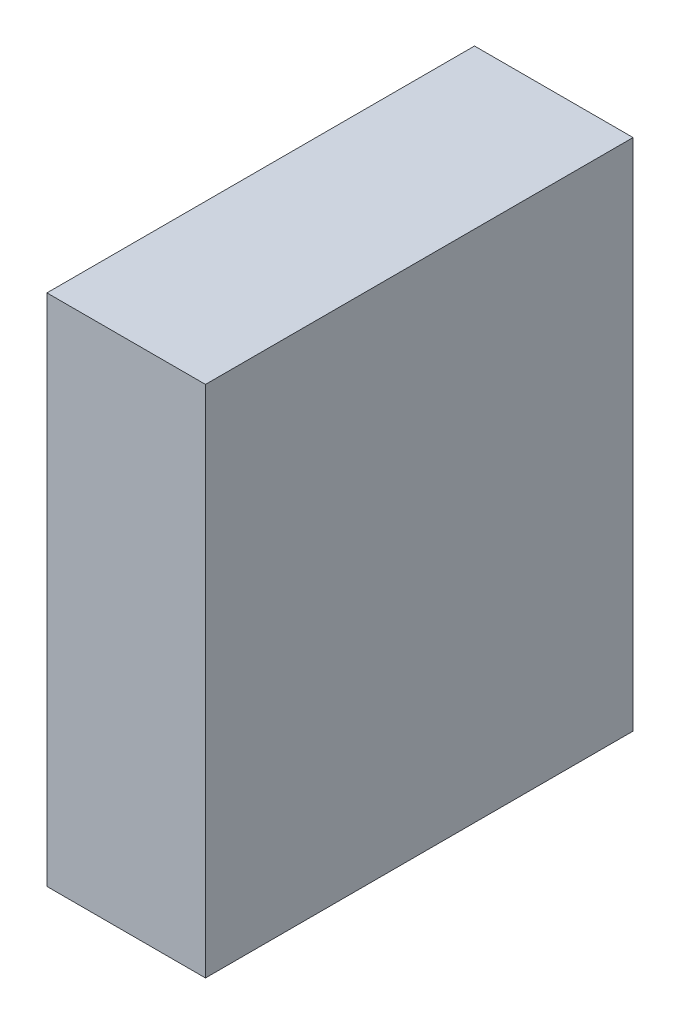
ISO-10303-21;
HEADER;
FILE_DESCRIPTION(('STEP AP214'),'2;1');
FILE_NAME('part.step','',(''),(''),'','','');
FILE_SCHEMA(('AUTOMOTIVE_DESIGN { 1 0 10303 214 1 1 1 1 }'));
ENDSEC;
DATA;
#1=APPLICATION_CONTEXT('core data for automotive mechanical design processes');
#2=APPLICATION_PROTOCOL_DEFINITION('international standard','automotive_design',2000,#1);
#3=PRODUCT_CONTEXT('',#1,'mechanical');
#4=PRODUCT('Part','Part','',(#3));
#5=PRODUCT_RELATED_PRODUCT_CATEGORY('part','',(#4));
#6=PRODUCT_DEFINITION_FORMATION('','',#4);
#7=PRODUCT_DEFINITION_CONTEXT('part definition',#1,'design');
#8=PRODUCT_DEFINITION('design','',#6,#7);
#9=PRODUCT_DEFINITION_SHAPE('','',#8);
#10=(LENGTH_UNIT() NAMED_UNIT(*) SI_UNIT(.MILLI.,.METRE.));
#11=(NAMED_UNIT(*) PLANE_ANGLE_UNIT() SI_UNIT($,.RADIAN.));
#12=(NAMED_UNIT(*) SI_UNIT($,.STERADIAN.) SOLID_ANGLE_UNIT());
#13=UNCERTAINTY_MEASURE_WITH_UNIT(LENGTH_MEASURE(1.E-05),#10,'distance_accuracy_value','');
#14=(GEOMETRIC_REPRESENTATION_CONTEXT(3) GLOBAL_UNCERTAINTY_ASSIGNED_CONTEXT((#13)) GLOBAL_UNIT_ASSIGNED_CONTEXT((#10,
#11,#12)) REPRESENTATION_CONTEXT('',''));
#15=CARTESIAN_POINT('',(0.,0.,0.));
#16=DIRECTION('',(0.,0.,1.));
#17=DIRECTION('',(1.,0.,0.));
#18=AXIS2_PLACEMENT_3D('',#15,#16,#17);
#19=CARTESIAN_POINT('',(16.5,53.5,89.));
#20=DIRECTION('',(-1.,0.,0.));
#21=DIRECTION('',(0.,-1.,0.));
#22=AXIS2_PLACEMENT_3D('',#19,#20,#21);
#23=PLANE('',#22);
#24=DIRECTION('',(0.,1.,0.));
#25=VECTOR('',#24,1.);
#26=CARTESIAN_POINT('',(16.5,53.5,0.));
#27=LINE('',#26,#25);
#28=CARTESIAN_POINT('',(16.5,-53.5,0.));
#29=VERTEX_POINT('',#28);
#30=CARTESIAN_POINT('',(16.5,53.5,0.));
#31=VERTEX_POINT('',#30);
#32=EDGE_CURVE('E96',#29,#31,#27,.T.);
#33=ORIENTED_EDGE('',*,*,#32,.T.);
#34=DIRECTION('',(0.,0.,-1.));
#35=VECTOR('',#34,1.);
#36=CARTESIAN_POINT('',(16.5,53.5,89.));
#37=LINE('',#36,#35);
#38=CARTESIAN_POINT('',(16.5,53.5,89.));
#39=VERTEX_POINT('',#38);
#40=EDGE_CURVE('E11',#39,#31,#37,.T.);
#41=ORIENTED_EDGE('',*,*,#40,.F.);
#42=DIRECTION('',(0.,1.,0.));
#43=VECTOR('',#42,1.);
#44=CARTESIAN_POINT('',(16.5,53.5,89.));
#45=LINE('',#44,#43);
#46=CARTESIAN_POINT('',(16.5,-53.5,89.));
#47=VERTEX_POINT('',#46);
#48=EDGE_CURVE('E84',#47,#39,#45,.T.);
#49=ORIENTED_EDGE('',*,*,#48,.F.);
#50=DIRECTION('',(0.,0.,-1.));
#51=VECTOR('',#50,1.);
#52=CARTESIAN_POINT('',(16.5,-53.5,89.));
#53=LINE('',#52,#51);
#54=EDGE_CURVE('E92',#47,#29,#53,.T.);
#55=ORIENTED_EDGE('',*,*,#54,.T.);
#56=EDGE_LOOP('',(#33,#41,#49,#55));
#57=FACE_BOUND('',#56,.T.);
#58=ADVANCED_FACE('F33',(#57),#23,.F.);
#59=CARTESIAN_POINT('',(-16.5,53.5,89.));
#60=DIRECTION('',(0.,-1.,0.));
#61=DIRECTION('',(0.,0.,-1.));
#62=AXIS2_PLACEMENT_3D('',#59,#60,#61);
#63=PLANE('',#62);
#64=DIRECTION('',(-1.,0.,0.));
#65=VECTOR('',#64,1.);
#66=CARTESIAN_POINT('',(-16.5,53.5,0.));
#67=LINE('',#66,#65);
#68=CARTESIAN_POINT('',(-16.5,53.5,0.));
#69=VERTEX_POINT('',#68);
#70=EDGE_CURVE('E88',#31,#69,#67,.T.);
#71=ORIENTED_EDGE('',*,*,#70,.T.);
#72=DIRECTION('',(0.,0.,-1.));
#73=VECTOR('',#72,1.);
#74=CARTESIAN_POINT('',(-16.5,53.5,89.));
#75=LINE('',#74,#73);
#76=CARTESIAN_POINT('',(-16.5,53.5,89.));
#77=VERTEX_POINT('',#76);
#78=EDGE_CURVE('E41',#77,#69,#75,.T.);
#79=ORIENTED_EDGE('',*,*,#78,.F.);
#80=DIRECTION('',(-1.,0.,0.));
#81=VECTOR('',#80,1.);
#82=CARTESIAN_POINT('',(-16.5,53.5,89.));
#83=LINE('',#82,#81);
#84=EDGE_CURVE('E79',#39,#77,#83,.T.);
#85=ORIENTED_EDGE('',*,*,#84,.F.);
#86=ORIENTED_EDGE('',*,*,#40,.T.);
#87=EDGE_LOOP('',(#71,#79,#85,#86));
#88=FACE_BOUND('',#87,.T.);
#89=ADVANCED_FACE('F87',(#88),#63,.F.);
#90=CARTESIAN_POINT('',(-16.5,53.5,89.));
#91=DIRECTION('',(1.,0.,0.));
#92=DIRECTION('',(0.,1.,0.));
#93=AXIS2_PLACEMENT_3D('',#90,#91,#92);
#94=PLANE('',#93);
#95=DIRECTION('',(0.,-1.,0.));
#96=VECTOR('',#95,1.);
#97=CARTESIAN_POINT('',(-16.5,53.5,0.));
#98=LINE('',#97,#96);
#99=CARTESIAN_POINT('',(-16.5,-53.5,0.));
#100=VERTEX_POINT('',#99);
#101=EDGE_CURVE('E66',#69,#100,#98,.T.);
#102=ORIENTED_EDGE('',*,*,#101,.T.);
#103=DIRECTION('',(0.,0.,-1.));
#104=VECTOR('',#103,1.);
#105=CARTESIAN_POINT('',(-16.5,-53.5,89.));
#106=LINE('',#105,#104);
#107=CARTESIAN_POINT('',(-16.5,-53.5,89.));
#108=VERTEX_POINT('',#107);
#109=EDGE_CURVE('E89',#108,#100,#106,.T.);
#110=ORIENTED_EDGE('',*,*,#109,.F.);
#111=DIRECTION('',(0.,-1.,0.));
#112=VECTOR('',#111,1.);
#113=CARTESIAN_POINT('',(-16.5,53.5,89.));
#114=LINE('',#113,#112);
#115=EDGE_CURVE('E82',#77,#108,#114,.T.);
#116=ORIENTED_EDGE('',*,*,#115,.F.);
#117=ORIENTED_EDGE('',*,*,#78,.T.);
#118=EDGE_LOOP('',(#102,#110,#116,#117));
#119=FACE_BOUND('',#118,.T.);
#120=ADVANCED_FACE('F90',(#119),#94,.F.);
#121=CARTESIAN_POINT('',(-16.5,-53.5,89.));
#122=DIRECTION('',(0.,1.,0.));
#123=DIRECTION('',(0.,0.,1.));
#124=AXIS2_PLACEMENT_3D('',#121,#122,#123);
#125=PLANE('',#124);
#126=DIRECTION('',(1.,0.,0.));
#127=VECTOR('',#126,1.);
#128=CARTESIAN_POINT('',(-16.5,-53.5,0.));
#129=LINE('',#128,#127);
#130=EDGE_CURVE('E72',#100,#29,#129,.T.);
#131=ORIENTED_EDGE('',*,*,#130,.T.);
#132=ORIENTED_EDGE('',*,*,#54,.F.);
#133=DIRECTION('',(1.,0.,0.));
#134=VECTOR('',#133,1.);
#135=CARTESIAN_POINT('',(-16.5,-53.5,89.));
#136=LINE('',#135,#134);
#137=EDGE_CURVE('E49',#108,#47,#136,.T.);
#138=ORIENTED_EDGE('',*,*,#137,.F.);
#139=ORIENTED_EDGE('',*,*,#109,.T.);
#140=EDGE_LOOP('',(#131,#132,#138,#139));
#141=FACE_BOUND('',#140,.T.);
#142=ADVANCED_FACE('F103',(#141),#125,.F.);
#143=CARTESIAN_POINT('',(0.,0.,89.));
#144=DIRECTION('',(0.,0.,1.));
#145=DIRECTION('',(1.,0.,0.));
#146=AXIS2_PLACEMENT_3D('',#143,#144,#145);
#147=PLANE('',#146);
#148=ORIENTED_EDGE('',*,*,#48,.T.);
#149=ORIENTED_EDGE('',*,*,#84,.T.);
#150=ORIENTED_EDGE('',*,*,#115,.T.);
#151=ORIENTED_EDGE('',*,*,#137,.T.);
#152=EDGE_LOOP('',(#148,#149,#150,#151));
#153=FACE_BOUND('',#152,.T.);
#154=ADVANCED_FACE('F80',(#153),#147,.T.);
#155=CARTESIAN_POINT('',(0.,0.,0.));
#156=DIRECTION('',(0.,0.,1.));
#157=DIRECTION('',(1.,0.,0.));
#158=AXIS2_PLACEMENT_3D('',#155,#156,#157);
#159=PLANE('',#158);
#160=ORIENTED_EDGE('',*,*,#32,.F.);
#161=ORIENTED_EDGE('',*,*,#130,.F.);
#162=ORIENTED_EDGE('',*,*,#101,.F.);
#163=ORIENTED_EDGE('',*,*,#70,.F.);
#164=EDGE_LOOP('',(#160,#161,#162,#163));
#165=FACE_BOUND('',#164,.T.);
#166=ADVANCED_FACE('F106',(#165),#159,.F.);
#167=CLOSED_SHELL('',(#58,#89,#120,#142,#154,#166));
#168=MANIFOLD_SOLID_BREP('B2',#167);
#169=ADVANCED_BREP_SHAPE_REPRESENTATION('',(#18,#168),#14);
#170=SHAPE_DEFINITION_REPRESENTATION(#9,#169);
ENDSEC;
END-ISO-10303-21;
